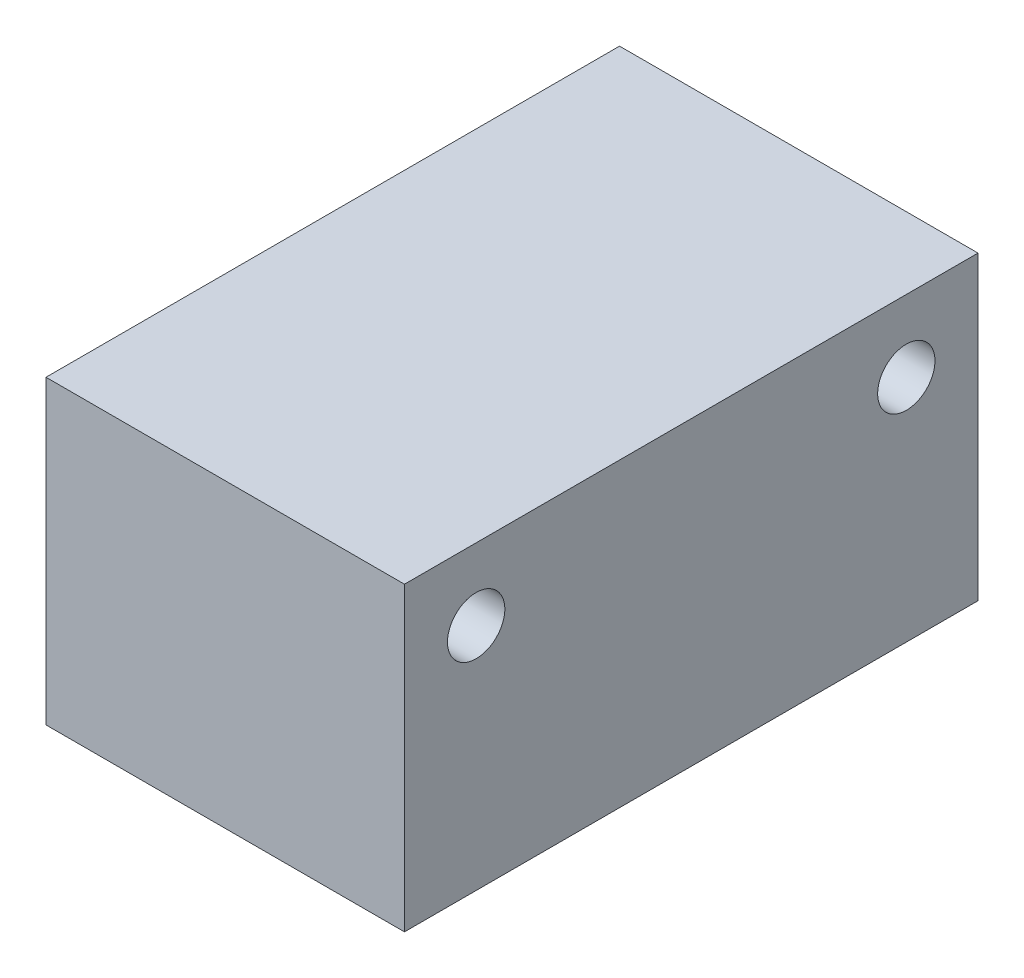
ISO-10303-21;
HEADER;
FILE_DESCRIPTION(('STEP AP214'),'2;1');
FILE_NAME('part.step','',(''),(''),'','','');
FILE_SCHEMA(('AUTOMOTIVE_DESIGN { 1 0 10303 214 1 1 1 1 }'));
ENDSEC;
DATA;
#1=APPLICATION_CONTEXT('core data for automotive mechanical design processes');
#2=APPLICATION_PROTOCOL_DEFINITION('international standard','automotive_design',2000,#1);
#3=PRODUCT_CONTEXT('',#1,'mechanical');
#4=PRODUCT('Part','Part','',(#3));
#5=PRODUCT_RELATED_PRODUCT_CATEGORY('part','',(#4));
#6=PRODUCT_DEFINITION_FORMATION('','',#4);
#7=PRODUCT_DEFINITION_CONTEXT('part definition',#1,'design');
#8=PRODUCT_DEFINITION('design','',#6,#7);
#9=PRODUCT_DEFINITION_SHAPE('','',#8);
#10=(LENGTH_UNIT() NAMED_UNIT(*) SI_UNIT(.MILLI.,.METRE.));
#11=(NAMED_UNIT(*) PLANE_ANGLE_UNIT() SI_UNIT($,.RADIAN.));
#12=(NAMED_UNIT(*) SI_UNIT($,.STERADIAN.) SOLID_ANGLE_UNIT());
#13=UNCERTAINTY_MEASURE_WITH_UNIT(LENGTH_MEASURE(1.E-05),#10,'distance_accuracy_value','');
#14=(GEOMETRIC_REPRESENTATION_CONTEXT(3) GLOBAL_UNCERTAINTY_ASSIGNED_CONTEXT((#13)) GLOBAL_UNIT_ASSIGNED_CONTEXT((#10,
#11,#12)) REPRESENTATION_CONTEXT('',''));
#15=CARTESIAN_POINT('',(0.,0.,0.));
#16=DIRECTION('',(0.,0.,1.));
#17=DIRECTION('',(1.,0.,0.));
#18=AXIS2_PLACEMENT_3D('',#15,#16,#17);
#19=CARTESIAN_POINT('',(25.,42.,40.));
#20=DIRECTION('',(-1.,0.,0.));
#21=DIRECTION('',(0.,0.,1.));
#22=AXIS2_PLACEMENT_3D('',#19,#20,#21);
#23=PLANE('',#22);
#24=CARTESIAN_POINT('',(25.,32.,-30.));
#25=DIRECTION('',(-1.,0.,0.));
#26=DIRECTION('',(0.,0.,1.));
#27=AXIS2_PLACEMENT_3D('',#24,#25,#26);
#28=CIRCLE('',#27,4.);
#29=CARTESIAN_POINT('',(25.,32.,-26.));
#30=VERTEX_POINT('',#29);
#31=EDGE_CURVE('E207',#30,#30,#28,.T.);
#32=ORIENTED_EDGE('',*,*,#31,.T.);
#33=EDGE_LOOP('',(#32));
#34=FACE_BOUND('',#33,.T.);
#35=CARTESIAN_POINT('',(25.,32.,30.));
#36=DIRECTION('',(-1.,0.,0.));
#37=DIRECTION('',(0.,0.,1.));
#38=AXIS2_PLACEMENT_3D('',#35,#36,#37);
#39=CIRCLE('',#38,4.00000000000001);
#40=CARTESIAN_POINT('',(25.,32.,34.));
#41=VERTEX_POINT('',#40);
#42=EDGE_CURVE('E211',#41,#41,#39,.T.);
#43=ORIENTED_EDGE('',*,*,#42,.T.);
#44=EDGE_LOOP('',(#43));
#45=FACE_BOUND('',#44,.T.);
#46=DIRECTION('',(0.,0.,-1.));
#47=VECTOR('',#46,1.);
#48=CARTESIAN_POINT('',(25.,0.,40.));
#49=LINE('',#48,#47);
#50=CARTESIAN_POINT('',(25.,0.,40.));
#51=VERTEX_POINT('',#50);
#52=CARTESIAN_POINT('',(25.,0.,-40.));
#53=VERTEX_POINT('',#52);
#54=EDGE_CURVE('E116',#51,#53,#49,.T.);
#55=ORIENTED_EDGE('',*,*,#54,.T.);
#56=DIRECTION('',(0.,-1.,0.));
#57=VECTOR('',#56,1.);
#58=CARTESIAN_POINT('',(25.,42.,-40.));
#59=LINE('',#58,#57);
#60=CARTESIAN_POINT('',(25.,42.,-40.));
#61=VERTEX_POINT('',#60);
#62=EDGE_CURVE('E11',#61,#53,#59,.T.);
#63=ORIENTED_EDGE('',*,*,#62,.F.);
#64=DIRECTION('',(0.,0.,-1.));
#65=VECTOR('',#64,1.);
#66=CARTESIAN_POINT('',(25.,42.,40.));
#67=LINE('',#66,#65);
#68=CARTESIAN_POINT('',(25.,42.,40.));
#69=VERTEX_POINT('',#68);
#70=EDGE_CURVE('E125',#69,#61,#67,.T.);
#71=ORIENTED_EDGE('',*,*,#70,.F.);
#72=DIRECTION('',(0.,-1.,0.));
#73=VECTOR('',#72,1.);
#74=CARTESIAN_POINT('',(25.,42.,40.));
#75=LINE('',#74,#73);
#76=EDGE_CURVE('E134',#69,#51,#75,.T.);
#77=ORIENTED_EDGE('',*,*,#76,.T.);
#78=EDGE_LOOP('',(#55,#63,#71,#77));
#79=FACE_BOUND('',#78,.T.);
#80=ADVANCED_FACE('F32',(#34,#45,#79),#23,.F.);
#81=CARTESIAN_POINT('',(-25.,42.,-40.));
#82=DIRECTION('',(0.,0.,1.));
#83=DIRECTION('',(1.,0.,0.));
#84=AXIS2_PLACEMENT_3D('',#81,#82,#83);
#85=PLANE('',#84);
#86=DIRECTION('',(-1.,0.,0.));
#87=VECTOR('',#86,1.);
#88=CARTESIAN_POINT('',(-25.,0.,-40.));
#89=LINE('',#88,#87);
#90=CARTESIAN_POINT('',(-25.,0.,-40.));
#91=VERTEX_POINT('',#90);
#92=EDGE_CURVE('E119',#53,#91,#89,.T.);
#93=ORIENTED_EDGE('',*,*,#92,.T.);
#94=DIRECTION('',(0.,-1.,0.));
#95=VECTOR('',#94,1.);
#96=CARTESIAN_POINT('',(-25.,42.,-40.));
#97=LINE('',#96,#95);
#98=CARTESIAN_POINT('',(-25.,42.,-40.));
#99=VERTEX_POINT('',#98);
#100=EDGE_CURVE('E39',#99,#91,#97,.T.);
#101=ORIENTED_EDGE('',*,*,#100,.F.);
#102=DIRECTION('',(-1.,0.,0.));
#103=VECTOR('',#102,1.);
#104=CARTESIAN_POINT('',(-25.,42.,-40.));
#105=LINE('',#104,#103);
#106=EDGE_CURVE('E128',#61,#99,#105,.T.);
#107=ORIENTED_EDGE('',*,*,#106,.F.);
#108=ORIENTED_EDGE('',*,*,#62,.T.);
#109=EDGE_LOOP('',(#93,#101,#107,#108));
#110=FACE_BOUND('',#109,.T.);
#111=ADVANCED_FACE('F165',(#110),#85,.F.);
#112=CARTESIAN_POINT('',(-25.,42.,40.));
#113=DIRECTION('',(1.,0.,0.));
#114=DIRECTION('',(0.,0.,-1.));
#115=AXIS2_PLACEMENT_3D('',#112,#113,#114);
#116=PLANE('',#115);
#117=CARTESIAN_POINT('',(-25.,32.,-30.));
#118=DIRECTION('',(-1.,0.,0.));
#119=DIRECTION('',(0.,0.,1.));
#120=AXIS2_PLACEMENT_3D('',#117,#118,#119);
#121=CIRCLE('',#120,4.);
#122=CARTESIAN_POINT('',(-25.,32.,-26.));
#123=VERTEX_POINT('',#122);
#124=EDGE_CURVE('E210',#123,#123,#121,.T.);
#125=ORIENTED_EDGE('',*,*,#124,.F.);
#126=EDGE_LOOP('',(#125));
#127=FACE_BOUND('',#126,.T.);
#128=CARTESIAN_POINT('',(-25.,32.,30.));
#129=DIRECTION('',(-1.,0.,0.));
#130=DIRECTION('',(0.,0.,1.));
#131=AXIS2_PLACEMENT_3D('',#128,#129,#130);
#132=CIRCLE('',#131,4.00000000000001);
#133=CARTESIAN_POINT('',(-25.,32.,34.));
#134=VERTEX_POINT('',#133);
#135=EDGE_CURVE('E215',#134,#134,#132,.T.);
#136=ORIENTED_EDGE('',*,*,#135,.F.);
#137=EDGE_LOOP('',(#136));
#138=FACE_BOUND('',#137,.T.);
#139=DIRECTION('',(0.,0.,1.));
#140=VECTOR('',#139,1.);
#141=CARTESIAN_POINT('',(-25.,0.,40.));
#142=LINE('',#141,#140);
#143=CARTESIAN_POINT('',(-25.,0.,40.));
#144=VERTEX_POINT('',#143);
#145=EDGE_CURVE('E137',#91,#144,#142,.T.);
#146=ORIENTED_EDGE('',*,*,#145,.T.);
#147=DIRECTION('',(0.,-1.,0.));
#148=VECTOR('',#147,1.);
#149=CARTESIAN_POINT('',(-25.,42.,40.));
#150=LINE('',#149,#148);
#151=CARTESIAN_POINT('',(-25.,42.,40.));
#152=VERTEX_POINT('',#151);
#153=EDGE_CURVE('E142',#152,#144,#150,.T.);
#154=ORIENTED_EDGE('',*,*,#153,.F.);
#155=DIRECTION('',(0.,0.,1.));
#156=VECTOR('',#155,1.);
#157=CARTESIAN_POINT('',(-25.,42.,40.));
#158=LINE('',#157,#156);
#159=EDGE_CURVE('E131',#99,#152,#158,.T.);
#160=ORIENTED_EDGE('',*,*,#159,.F.);
#161=ORIENTED_EDGE('',*,*,#100,.T.);
#162=EDGE_LOOP('',(#146,#154,#160,#161));
#163=FACE_BOUND('',#162,.T.);
#164=ADVANCED_FACE('F149',(#127,#138,#163),#116,.F.);
#165=CARTESIAN_POINT('',(-25.,42.,40.));
#166=DIRECTION('',(0.,0.,-1.));
#167=DIRECTION('',(-1.,0.,0.));
#168=AXIS2_PLACEMENT_3D('',#165,#166,#167);
#169=PLANE('',#168);
#170=DIRECTION('',(1.,0.,0.));
#171=VECTOR('',#170,1.);
#172=CARTESIAN_POINT('',(-25.,0.,40.));
#173=LINE('',#172,#171);
#174=EDGE_CURVE('E129',#144,#51,#173,.T.);
#175=ORIENTED_EDGE('',*,*,#174,.T.);
#176=ORIENTED_EDGE('',*,*,#76,.F.);
#177=DIRECTION('',(1.,0.,0.));
#178=VECTOR('',#177,1.);
#179=CARTESIAN_POINT('',(-25.,42.,40.));
#180=LINE('',#179,#178);
#181=EDGE_CURVE('E133',#152,#69,#180,.T.);
#182=ORIENTED_EDGE('',*,*,#181,.F.);
#183=ORIENTED_EDGE('',*,*,#153,.T.);
#184=EDGE_LOOP('',(#175,#176,#182,#183));
#185=FACE_BOUND('',#184,.T.);
#186=ADVANCED_FACE('F158',(#185),#169,.F.);
#187=CARTESIAN_POINT('',(0.,42.,0.));
#188=DIRECTION('',(0.,-1.,0.));
#189=DIRECTION('',(0.,0.,-1.));
#190=AXIS2_PLACEMENT_3D('',#187,#188,#189);
#191=PLANE('',#190);
#192=ORIENTED_EDGE('',*,*,#70,.T.);
#193=ORIENTED_EDGE('',*,*,#106,.T.);
#194=ORIENTED_EDGE('',*,*,#159,.T.);
#195=ORIENTED_EDGE('',*,*,#181,.T.);
#196=EDGE_LOOP('',(#192,#193,#194,#195));
#197=FACE_BOUND('',#196,.T.);
#198=ADVANCED_FACE('F164',(#197),#191,.F.);
#199=CARTESIAN_POINT('',(0.,0.,0.));
#200=DIRECTION('',(0.,-1.,0.));
#201=DIRECTION('',(0.,0.,-1.));
#202=AXIS2_PLACEMENT_3D('',#199,#200,#201);
#203=PLANE('',#202);
#204=DIRECTION('',(0.,0.,1.));
#205=VECTOR('',#204,1.);
#206=CARTESIAN_POINT('',(17.5,0.,-22.5));
#207=LINE('',#206,#205);
#208=CARTESIAN_POINT('',(17.5,0.,-22.5));
#209=VERTEX_POINT('',#208);
#210=CARTESIAN_POINT('',(17.5,0.,22.5));
#211=VERTEX_POINT('',#210);
#212=EDGE_CURVE('E46',#209,#211,#207,.T.);
#213=ORIENTED_EDGE('',*,*,#212,.F.);
#214=DIRECTION('',(1.,0.,0.));
#215=VECTOR('',#214,1.);
#216=CARTESIAN_POINT('',(-17.5,0.,-22.5));
#217=LINE('',#216,#215);
#218=CARTESIAN_POINT('',(-17.5,0.,-22.5));
#219=VERTEX_POINT('',#218);
#220=EDGE_CURVE('E50',#219,#209,#217,.T.);
#221=ORIENTED_EDGE('',*,*,#220,.F.);
#222=DIRECTION('',(0.,0.,-1.));
#223=VECTOR('',#222,1.);
#224=CARTESIAN_POINT('',(-17.5,0.,-22.5));
#225=LINE('',#224,#223);
#226=CARTESIAN_POINT('',(-17.5,0.,22.5));
#227=VERTEX_POINT('',#226);
#228=EDGE_CURVE('E226',#227,#219,#225,.T.);
#229=ORIENTED_EDGE('',*,*,#228,.F.);
#230=DIRECTION('',(-1.,0.,0.));
#231=VECTOR('',#230,1.);
#232=CARTESIAN_POINT('',(-17.5,0.,22.5));
#233=LINE('',#232,#231);
#234=EDGE_CURVE('E224',#211,#227,#233,.T.);
#235=ORIENTED_EDGE('',*,*,#234,.F.);
#236=EDGE_LOOP('',(#213,#221,#229,#235));
#237=FACE_BOUND('',#236,.T.);
#238=ORIENTED_EDGE('',*,*,#54,.F.);
#239=ORIENTED_EDGE('',*,*,#174,.F.);
#240=ORIENTED_EDGE('',*,*,#145,.F.);
#241=ORIENTED_EDGE('',*,*,#92,.F.);
#242=EDGE_LOOP('',(#238,#239,#240,#241));
#243=FACE_BOUND('',#242,.T.);
#244=ADVANCED_FACE('F155',(#237,#243),#203,.T.);
#245=CARTESIAN_POINT('',(17.5,-5.,-22.5));
#246=DIRECTION('',(-1.,0.,0.));
#247=DIRECTION('',(0.,0.,1.));
#248=AXIS2_PLACEMENT_3D('',#245,#246,#247);
#249=PLANE('',#248);
#250=ORIENTED_EDGE('',*,*,#212,.T.);
#251=DIRECTION('',(0.,1.,0.));
#252=VECTOR('',#251,1.);
#253=CARTESIAN_POINT('',(17.5,-5.,22.5));
#254=LINE('',#253,#252);
#255=CARTESIAN_POINT('',(17.5,-5.,22.5));
#256=VERTEX_POINT('',#255);
#257=EDGE_CURVE('E99',#256,#211,#254,.T.);
#258=ORIENTED_EDGE('',*,*,#257,.F.);
#259=DIRECTION('',(0.,0.,1.));
#260=VECTOR('',#259,1.);
#261=CARTESIAN_POINT('',(17.5,-5.,-22.5));
#262=LINE('',#261,#260);
#263=CARTESIAN_POINT('',(17.5,-5.,-22.5));
#264=VERTEX_POINT('',#263);
#265=EDGE_CURVE('E105',#264,#256,#262,.T.);
#266=ORIENTED_EDGE('',*,*,#265,.F.);
#267=DIRECTION('',(0.,1.,0.));
#268=VECTOR('',#267,1.);
#269=CARTESIAN_POINT('',(17.5,-5.,-22.5));
#270=LINE('',#269,#268);
#271=EDGE_CURVE('E222',#264,#209,#270,.T.);
#272=ORIENTED_EDGE('',*,*,#271,.T.);
#273=EDGE_LOOP('',(#250,#258,#266,#272));
#274=FACE_BOUND('',#273,.T.);
#275=ADVANCED_FACE('F115',(#274),#249,.F.);
#276=CARTESIAN_POINT('',(-17.5,-5.,22.5));
#277=DIRECTION('',(0.,0.,-1.));
#278=DIRECTION('',(-1.,0.,0.));
#279=AXIS2_PLACEMENT_3D('',#276,#277,#278);
#280=PLANE('',#279);
#281=ORIENTED_EDGE('',*,*,#234,.T.);
#282=DIRECTION('',(0.,1.,0.));
#283=VECTOR('',#282,1.);
#284=CARTESIAN_POINT('',(-17.5,-5.,22.5));
#285=LINE('',#284,#283);
#286=CARTESIAN_POINT('',(-17.5,-5.,22.5));
#287=VERTEX_POINT('',#286);
#288=EDGE_CURVE('E101',#287,#227,#285,.T.);
#289=ORIENTED_EDGE('',*,*,#288,.F.);
#290=DIRECTION('',(-1.,0.,0.));
#291=VECTOR('',#290,1.);
#292=CARTESIAN_POINT('',(-17.5,-5.,22.5));
#293=LINE('',#292,#291);
#294=EDGE_CURVE('E94',#256,#287,#293,.T.);
#295=ORIENTED_EDGE('',*,*,#294,.F.);
#296=ORIENTED_EDGE('',*,*,#257,.T.);
#297=EDGE_LOOP('',(#281,#289,#295,#296));
#298=FACE_BOUND('',#297,.T.);
#299=ADVANCED_FACE('F97',(#298),#280,.F.);
#300=CARTESIAN_POINT('',(-17.5,-5.,-22.5));
#301=DIRECTION('',(1.,0.,0.));
#302=DIRECTION('',(0.,0.,-1.));
#303=AXIS2_PLACEMENT_3D('',#300,#301,#302);
#304=PLANE('',#303);
#305=ORIENTED_EDGE('',*,*,#228,.T.);
#306=DIRECTION('',(0.,1.,0.));
#307=VECTOR('',#306,1.);
#308=CARTESIAN_POINT('',(-17.5,-5.,-22.5));
#309=LINE('',#308,#307);
#310=CARTESIAN_POINT('',(-17.5,-5.,-22.5));
#311=VERTEX_POINT('',#310);
#312=EDGE_CURVE('E121',#311,#219,#309,.T.);
#313=ORIENTED_EDGE('',*,*,#312,.F.);
#314=DIRECTION('',(0.,0.,-1.));
#315=VECTOR('',#314,1.);
#316=CARTESIAN_POINT('',(-17.5,-5.,-22.5));
#317=LINE('',#316,#315);
#318=EDGE_CURVE('E104',#287,#311,#317,.T.);
#319=ORIENTED_EDGE('',*,*,#318,.F.);
#320=ORIENTED_EDGE('',*,*,#288,.T.);
#321=EDGE_LOOP('',(#305,#313,#319,#320));
#322=FACE_BOUND('',#321,.T.);
#323=ADVANCED_FACE('F185',(#322),#304,.F.);
#324=CARTESIAN_POINT('',(-17.5,-5.,-22.5));
#325=DIRECTION('',(0.,0.,1.));
#326=DIRECTION('',(1.,0.,0.));
#327=AXIS2_PLACEMENT_3D('',#324,#325,#326);
#328=PLANE('',#327);
#329=ORIENTED_EDGE('',*,*,#220,.T.);
#330=ORIENTED_EDGE('',*,*,#271,.F.);
#331=DIRECTION('',(1.,0.,0.));
#332=VECTOR('',#331,1.);
#333=CARTESIAN_POINT('',(-17.5,-5.,-22.5));
#334=LINE('',#333,#332);
#335=EDGE_CURVE('E110',#311,#264,#334,.T.);
#336=ORIENTED_EDGE('',*,*,#335,.F.);
#337=ORIENTED_EDGE('',*,*,#312,.T.);
#338=EDGE_LOOP('',(#329,#330,#336,#337));
#339=FACE_BOUND('',#338,.T.);
#340=ADVANCED_FACE('F188',(#339),#328,.F.);
#341=CARTESIAN_POINT('',(0.,-5.,0.));
#342=DIRECTION('',(0.,1.,0.));
#343=DIRECTION('',(0.,0.,1.));
#344=AXIS2_PLACEMENT_3D('',#341,#342,#343);
#345=PLANE('',#344);
#346=ORIENTED_EDGE('',*,*,#265,.T.);
#347=ORIENTED_EDGE('',*,*,#294,.T.);
#348=ORIENTED_EDGE('',*,*,#318,.T.);
#349=ORIENTED_EDGE('',*,*,#335,.T.);
#350=EDGE_LOOP('',(#346,#347,#348,#349));
#351=FACE_BOUND('',#350,.T.);
#352=ADVANCED_FACE('F108',(#351),#345,.F.);
#353=CARTESIAN_POINT('',(25.,32.,30.));
#354=DIRECTION('',(-1.,0.,0.));
#355=DIRECTION('',(0.,0.,1.));
#356=AXIS2_PLACEMENT_3D('',#353,#354,#355);
#357=CYLINDRICAL_SURFACE('',#356,4.00000000000001);
#358=ORIENTED_EDGE('',*,*,#42,.F.);
#359=EDGE_LOOP('',(#358));
#360=FACE_BOUND('',#359,.T.);
#361=ORIENTED_EDGE('',*,*,#135,.T.);
#362=EDGE_LOOP('',(#361));
#363=FACE_BOUND('',#362,.T.);
#364=ADVANCED_FACE('F195',(#360,#363),#357,.F.);
#365=CARTESIAN_POINT('',(25.,32.,-30.));
#366=DIRECTION('',(-1.,0.,0.));
#367=DIRECTION('',(0.,0.,1.));
#368=AXIS2_PLACEMENT_3D('',#365,#366,#367);
#369=CYLINDRICAL_SURFACE('',#368,4.);
#370=ORIENTED_EDGE('',*,*,#31,.F.);
#371=EDGE_LOOP('',(#370));
#372=FACE_BOUND('',#371,.T.);
#373=ORIENTED_EDGE('',*,*,#124,.T.);
#374=EDGE_LOOP('',(#373));
#375=FACE_BOUND('',#374,.T.);
#376=ADVANCED_FACE('F198',(#372,#375),#369,.F.);
#377=CLOSED_SHELL('',(#80,#111,#164,#186,#198,#244,#275,#299,#323,#340,#352,#364,#376));
#378=MANIFOLD_SOLID_BREP('B2',#377);
#379=ADVANCED_BREP_SHAPE_REPRESENTATION('',(#18,#378),#14);
#380=SHAPE_DEFINITION_REPRESENTATION(#9,#379);
ENDSEC;
END-ISO-10303-21;
